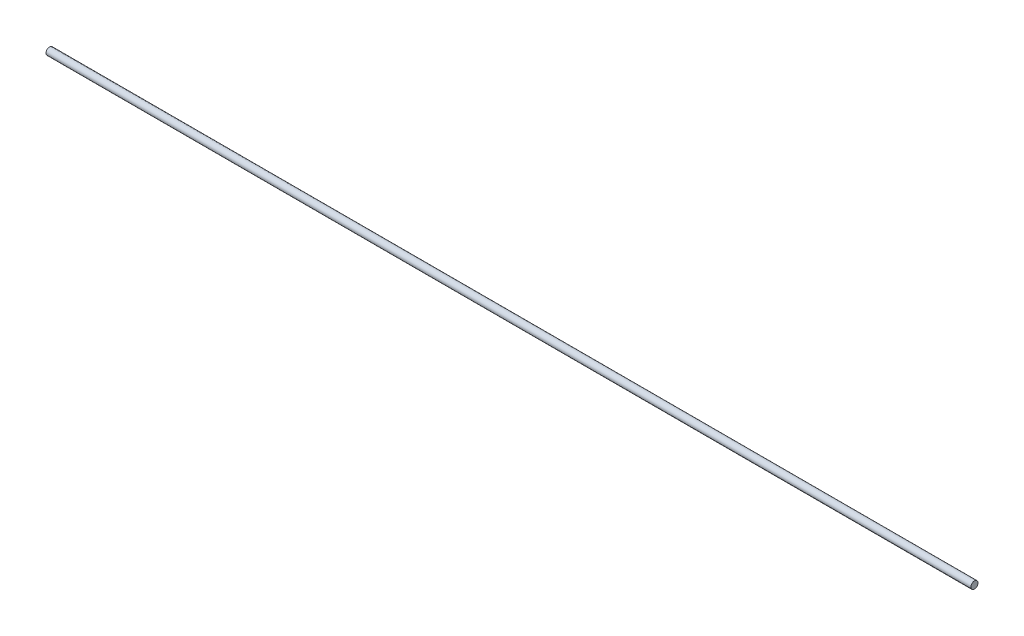
ISO-10303-21;
HEADER;
FILE_DESCRIPTION(('STEP AP214'),'2;1');
FILE_NAME('part.step','',(''),(''),'','','');
FILE_SCHEMA(('AUTOMOTIVE_DESIGN { 1 0 10303 214 1 1 1 1 }'));
ENDSEC;
DATA;
#1=APPLICATION_CONTEXT('core data for automotive mechanical design processes');
#2=APPLICATION_PROTOCOL_DEFINITION('international standard','automotive_design',2000,#1);
#3=PRODUCT_CONTEXT('',#1,'mechanical');
#4=PRODUCT('Part','Part','',(#3));
#5=PRODUCT_RELATED_PRODUCT_CATEGORY('part','',(#4));
#6=PRODUCT_DEFINITION_FORMATION('','',#4);
#7=PRODUCT_DEFINITION_CONTEXT('part definition',#1,'design');
#8=PRODUCT_DEFINITION('design','',#6,#7);
#9=PRODUCT_DEFINITION_SHAPE('','',#8);
#10=(LENGTH_UNIT() NAMED_UNIT(*) SI_UNIT(.MILLI.,.METRE.));
#11=(NAMED_UNIT(*) PLANE_ANGLE_UNIT() SI_UNIT($,.RADIAN.));
#12=(NAMED_UNIT(*) SI_UNIT($,.STERADIAN.) SOLID_ANGLE_UNIT());
#13=UNCERTAINTY_MEASURE_WITH_UNIT(LENGTH_MEASURE(1.E-05),#10,'distance_accuracy_value','');
#14=(GEOMETRIC_REPRESENTATION_CONTEXT(3) GLOBAL_UNCERTAINTY_ASSIGNED_CONTEXT((#13)) GLOBAL_UNIT_ASSIGNED_CONTEXT((#10,
#11,#12)) REPRESENTATION_CONTEXT('',''));
#15=CARTESIAN_POINT('',(0.,0.,0.));
#16=DIRECTION('',(0.,0.,1.));
#17=DIRECTION('',(1.,0.,0.));
#18=AXIS2_PLACEMENT_3D('',#15,#16,#17);
#19=CARTESIAN_POINT('',(645.,0.,0.));
#20=DIRECTION('',(-1.,0.,0.));
#21=DIRECTION('',(0.,0.,1.));
#22=AXIS2_PLACEMENT_3D('',#19,#20,#21);
#23=CYLINDRICAL_SURFACE('',#22,2.5);
#24=CARTESIAN_POINT('',(645.,0.,0.));
#25=DIRECTION('',(1.,0.,0.));
#26=DIRECTION('',(0.,0.,-1.));
#27=AXIS2_PLACEMENT_3D('',#24,#25,#26);
#28=CIRCLE('',#27,2.5);
#29=CARTESIAN_POINT('',(645.,0.,2.5));
#30=VERTEX_POINT('',#29);
#31=EDGE_CURVE('E10',#30,#30,#28,.T.);
#32=CARTESIAN_POINT('',(0.,0.,0.));
#33=DIRECTION('',(1.,0.,0.));
#34=DIRECTION('',(0.,0.,-1.));
#35=AXIS2_PLACEMENT_3D('',#32,#33,#34);
#36=CIRCLE('',#35,2.5);
#37=CARTESIAN_POINT('',(-1.11022302462516E-13,0.,2.5));
#38=VERTEX_POINT('',#37);
#39=EDGE_CURVE('E44',#38,#38,#36,.T.);
#40=CARTESIAN_POINT('',(645.,0.,2.5));
#41=CARTESIAN_POINT('',(638.28125,0.,2.5));
#42=CARTESIAN_POINT('',(631.5625,0.,2.5));
#43=CARTESIAN_POINT('',(618.125,0.,2.5));
#44=CARTESIAN_POINT('',(611.40625,0.,2.5));
#45=CARTESIAN_POINT('',(597.96875,0.,2.5));
#46=CARTESIAN_POINT('',(591.25,0.,2.5));
#47=CARTESIAN_POINT('',(577.8125,0.,2.5));
#48=CARTESIAN_POINT('',(571.09375,0.,2.5));
#49=CARTESIAN_POINT('',(557.65625,0.,2.5));
#50=CARTESIAN_POINT('',(550.9375,0.,2.5));
#51=CARTESIAN_POINT('',(537.5,0.,2.5));
#52=CARTESIAN_POINT('',(530.78125,0.,2.5));
#53=CARTESIAN_POINT('',(517.34375,0.,2.5));
#54=CARTESIAN_POINT('',(510.625,0.,2.5));
#55=CARTESIAN_POINT('',(497.1875,0.,2.5));
#56=CARTESIAN_POINT('',(490.46875,0.,2.5));
#57=CARTESIAN_POINT('',(477.03125,0.,2.5));
#58=CARTESIAN_POINT('',(470.3125,0.,2.5));
#59=CARTESIAN_POINT('',(456.875,0.,2.5));
#60=CARTESIAN_POINT('',(450.15625,0.,2.5));
#61=CARTESIAN_POINT('',(436.71875,0.,2.5));
#62=CARTESIAN_POINT('',(430.,0.,2.5));
#63=CARTESIAN_POINT('',(416.5625,0.,2.5));
#64=CARTESIAN_POINT('',(409.84375,0.,2.5));
#65=CARTESIAN_POINT('',(396.40625,0.,2.5));
#66=CARTESIAN_POINT('',(389.6875,0.,2.5));
#67=CARTESIAN_POINT('',(376.25,0.,2.5));
#68=CARTESIAN_POINT('',(369.53125,0.,2.5));
#69=CARTESIAN_POINT('',(356.09375,0.,2.5));
#70=CARTESIAN_POINT('',(349.375,0.,2.5));
#71=CARTESIAN_POINT('',(335.9375,0.,2.5));
#72=CARTESIAN_POINT('',(329.21875,0.,2.5));
#73=CARTESIAN_POINT('',(315.78125,0.,2.5));
#74=CARTESIAN_POINT('',(309.0625,0.,2.5));
#75=CARTESIAN_POINT('',(295.625,0.,2.5));
#76=CARTESIAN_POINT('',(288.90625,0.,2.5));
#77=CARTESIAN_POINT('',(275.46875,0.,2.5));
#78=CARTESIAN_POINT('',(268.75,0.,2.5));
#79=CARTESIAN_POINT('',(255.3125,0.,2.5));
#80=CARTESIAN_POINT('',(248.59375,0.,2.5));
#81=CARTESIAN_POINT('',(235.15625,0.,2.5));
#82=CARTESIAN_POINT('',(228.4375,0.,2.5));
#83=CARTESIAN_POINT('',(215.,0.,2.5));
#84=CARTESIAN_POINT('',(208.28125,0.,2.5));
#85=CARTESIAN_POINT('',(194.84375,0.,2.5));
#86=CARTESIAN_POINT('',(188.125,0.,2.5));
#87=CARTESIAN_POINT('',(174.6875,0.,2.5));
#88=CARTESIAN_POINT('',(167.96875,0.,2.5));
#89=CARTESIAN_POINT('',(154.53125,0.,2.5));
#90=CARTESIAN_POINT('',(147.8125,0.,2.5));
#91=CARTESIAN_POINT('',(134.375,0.,2.5));
#92=CARTESIAN_POINT('',(127.65625,0.,2.5));
#93=CARTESIAN_POINT('',(114.21875,0.,2.5));
#94=CARTESIAN_POINT('',(107.5,0.,2.5));
#95=CARTESIAN_POINT('',(94.0624999999999,0.,2.5));
#96=CARTESIAN_POINT('',(87.3437499999999,0.,2.5));
#97=CARTESIAN_POINT('',(73.9062499999999,0.,2.5));
#98=CARTESIAN_POINT('',(67.1874999999999,0.,2.5));
#99=CARTESIAN_POINT('',(53.7499999999999,0.,2.5));
#100=CARTESIAN_POINT('',(47.0312499999999,0.,2.5));
#101=CARTESIAN_POINT('',(33.5937499999999,0.,2.5));
#102=CARTESIAN_POINT('',(26.8749999999999,0.,2.5));
#103=CARTESIAN_POINT('',(13.4374999999999,0.,2.5));
#104=CARTESIAN_POINT('',(6.71874999999987,0.,2.5));
#105=CARTESIAN_POINT('',(-1.11022302462516E-13,0.,2.5));
#106=B_SPLINE_CURVE_WITH_KNOTS('',3,(#40,#41,#42,#43,#44,#45,#46,#47,#48,#49,#50,#51,#52,#53,
#54,#55,#56,#57,#58,#59,#60,#61,#62,#63,#64,#65,#66,#67,#68,#69,#70,#71,#72,#73,#74,#75,#76,#77,
#78,#79,#80,#81,#82,#83,#84,#85,#86,#87,#88,#89,#90,#91,#92,#93,#94,#95,#96,#97,#98,#99,#100,
#101,#102,#103,#104,#105),.UNSPECIFIED.,.F.,.F.,(4,2,2,2,2,2,2,2,2,2,2,2,2,2,2,2,2,2,2,2,2,2,2,
2,2,2,2,2,2,2,2,2,4),(0.,20.15625,40.3125,60.46875,80.6249999999999,100.78125,120.9375,
141.09375,161.25,181.40625,201.5625,221.71875,241.875,262.03125,282.1875,302.34375,322.5,
342.65625,362.8125,382.96875,403.125,423.28125,443.4375,463.59375,483.75,503.90625,524.0625,
544.21875,564.375,584.53125,604.6875,624.84375,645.),.UNSPECIFIED.);
#107=EDGE_CURVE('BSEAM41',#30,#38,#106,.T.);
#108=ORIENTED_EDGE('',*,*,#31,.F.);
#109=ORIENTED_EDGE('',*,*,#39,.T.);
#110=ORIENTED_EDGE('',*,*,#107,.T.);
#111=ORIENTED_EDGE('',*,*,#107,.F.);
#112=EDGE_LOOP('',(#108,#110,#109,#111));
#113=FACE_BOUND('',#112,.T.);
#114=ADVANCED_FACE('F41',(#113),#23,.T.);
#115=CARTESIAN_POINT('',(645.,0.,0.));
#116=DIRECTION('',(1.,0.,0.));
#117=DIRECTION('',(0.,0.,-1.));
#118=AXIS2_PLACEMENT_3D('',#115,#116,#117);
#119=PLANE('',#118);
#120=ORIENTED_EDGE('',*,*,#31,.T.);
#121=EDGE_LOOP('',(#120));
#122=FACE_BOUND('',#121,.T.);
#123=ADVANCED_FACE('F58',(#122),#119,.T.);
#124=CARTESIAN_POINT('',(0.,0.,0.));
#125=DIRECTION('',(1.,0.,0.));
#126=DIRECTION('',(0.,0.,-1.));
#127=AXIS2_PLACEMENT_3D('',#124,#125,#126);
#128=PLANE('',#127);
#129=ORIENTED_EDGE('',*,*,#39,.F.);
#130=EDGE_LOOP('',(#129));
#131=FACE_BOUND('',#130,.T.);
#132=ADVANCED_FACE('F56',(#131),#128,.F.);
#133=CLOSED_SHELL('',(#114,#123,#132));
#134=MANIFOLD_SOLID_BREP('B2',#133);
#135=ADVANCED_BREP_SHAPE_REPRESENTATION('',(#18,#134),#14);
#136=SHAPE_DEFINITION_REPRESENTATION(#9,#135);
ENDSEC;
END-ISO-10303-21;
